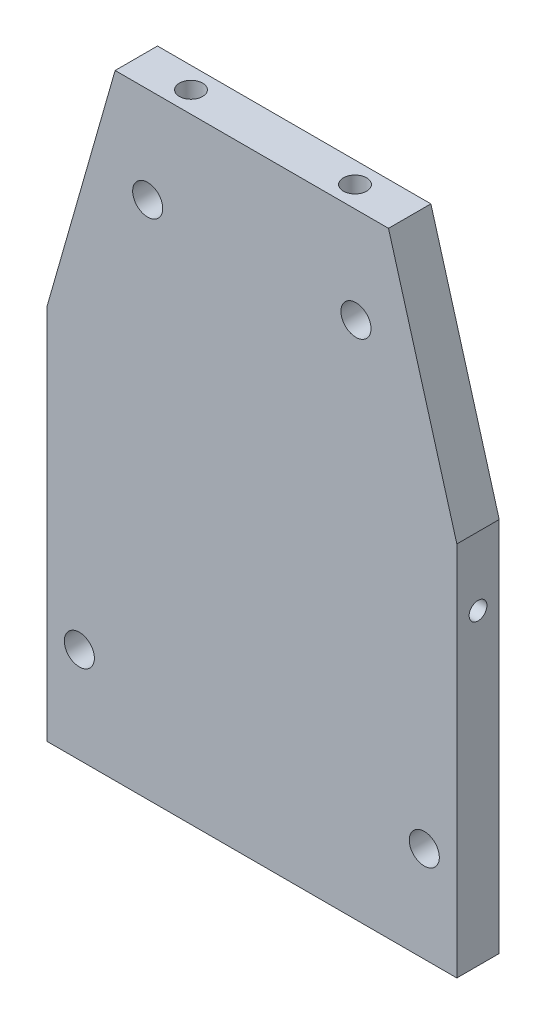
ISO-10303-21;
HEADER;
FILE_DESCRIPTION(('STEP AP214'),'2;1');
FILE_NAME('part.step','',(''),(''),'','','');
FILE_SCHEMA(('AUTOMOTIVE_DESIGN { 1 0 10303 214 1 1 1 1 }'));
ENDSEC;
DATA;
#1=APPLICATION_CONTEXT('core data for automotive mechanical design processes');
#2=APPLICATION_PROTOCOL_DEFINITION('international standard','automotive_design',2000,#1);
#3=PRODUCT_CONTEXT('',#1,'mechanical');
#4=PRODUCT('Part','Part','',(#3));
#5=PRODUCT_RELATED_PRODUCT_CATEGORY('part','',(#4));
#6=PRODUCT_DEFINITION_FORMATION('','',#4);
#7=PRODUCT_DEFINITION_CONTEXT('part definition',#1,'design');
#8=PRODUCT_DEFINITION('design','',#6,#7);
#9=PRODUCT_DEFINITION_SHAPE('','',#8);
#10=(LENGTH_UNIT() NAMED_UNIT(*) SI_UNIT(.MILLI.,.METRE.));
#11=(NAMED_UNIT(*) PLANE_ANGLE_UNIT() SI_UNIT($,.RADIAN.));
#12=(NAMED_UNIT(*) SI_UNIT($,.STERADIAN.) SOLID_ANGLE_UNIT());
#13=UNCERTAINTY_MEASURE_WITH_UNIT(LENGTH_MEASURE(1.E-05),#10,'distance_accuracy_value','');
#14=(GEOMETRIC_REPRESENTATION_CONTEXT(3) GLOBAL_UNCERTAINTY_ASSIGNED_CONTEXT((#13)) GLOBAL_UNIT_ASSIGNED_CONTEXT((#10,
#11,#12)) REPRESENTATION_CONTEXT('',''));
#15=CARTESIAN_POINT('',(0.,0.,0.));
#16=DIRECTION('',(0.,0.,1.));
#17=DIRECTION('',(1.,0.,0.));
#18=AXIS2_PLACEMENT_3D('',#15,#16,#17);
#19=CARTESIAN_POINT('',(-20.,45.,3.1));
#20=DIRECTION('',(0.961523947640823,-0.274721127897378,0.));
#21=DIRECTION('',(0.274721127897378,0.961523947640823,0.));
#22=AXIS2_PLACEMENT_3D('',#19,#20,#21);
#23=PLANE('',#22);
#24=DIRECTION('',(-0.274721127897378,-0.961523947640823,0.));
#25=VECTOR('',#24,1.);
#26=CARTESIAN_POINT('',(-20.,45.,-3.1));
#27=LINE('',#26,#25);
#28=CARTESIAN_POINT('',(-20.,45.,-3.1));
#29=VERTEX_POINT('',#28);
#30=CARTESIAN_POINT('',(-30.,9.99999999999999,-3.1));
#31=VERTEX_POINT('',#30);
#32=EDGE_CURVE('E128',#29,#31,#27,.T.);
#33=ORIENTED_EDGE('',*,*,#32,.T.);
#34=DIRECTION('',(0.,0.,-1.));
#35=VECTOR('',#34,1.);
#36=CARTESIAN_POINT('',(-30.,9.99999999999999,3.1));
#37=LINE('',#36,#35);
#38=CARTESIAN_POINT('',(-30.,9.99999999999999,3.1));
#39=VERTEX_POINT('',#38);
#40=EDGE_CURVE('E11',#39,#31,#37,.T.);
#41=ORIENTED_EDGE('',*,*,#40,.F.);
#42=DIRECTION('',(-0.274721127897378,-0.961523947640823,0.));
#43=VECTOR('',#42,1.);
#44=CARTESIAN_POINT('',(-20.,45.,3.1));
#45=LINE('',#44,#43);
#46=CARTESIAN_POINT('',(-20.,45.,3.1));
#47=VERTEX_POINT('',#46);
#48=EDGE_CURVE('E145',#47,#39,#45,.T.);
#49=ORIENTED_EDGE('',*,*,#48,.F.);
#50=DIRECTION('',(0.,0.,-1.));
#51=VECTOR('',#50,1.);
#52=CARTESIAN_POINT('',(-20.,45.,3.1));
#53=LINE('',#52,#51);
#54=EDGE_CURVE('E124',#47,#29,#53,.T.);
#55=ORIENTED_EDGE('',*,*,#54,.T.);
#56=EDGE_LOOP('',(#33,#41,#49,#55));
#57=FACE_BOUND('',#56,.T.);
#58=ADVANCED_FACE('F39',(#57),#23,.F.);
#59=CARTESIAN_POINT('',(-30.,9.99999999999999,3.1));
#60=DIRECTION('',(1.,0.,0.));
#61=DIRECTION('',(0.,1.,0.));
#62=AXIS2_PLACEMENT_3D('',#59,#60,#61);
#63=PLANE('',#62);
#64=CARTESIAN_POINT('',(-30.,0.,0.));
#65=DIRECTION('',(-1.,0.,0.));
#66=DIRECTION('',(0.,-1.,0.));
#67=AXIS2_PLACEMENT_3D('',#64,#65,#66);
#68=CIRCLE('',#67,1.3);
#69=CARTESIAN_POINT('',(-30.,-1.3,0.));
#70=VERTEX_POINT('',#69);
#71=EDGE_CURVE('E202',#70,#70,#68,.T.);
#72=ORIENTED_EDGE('',*,*,#71,.F.);
#73=EDGE_LOOP('',(#72));
#74=FACE_BOUND('',#73,.T.);
#75=DIRECTION('',(0.,-1.,0.));
#76=VECTOR('',#75,1.);
#77=CARTESIAN_POINT('',(-30.,9.99999999999999,-3.1));
#78=LINE('',#77,#76);
#79=CARTESIAN_POINT('',(-30.,-45.,-3.1));
#80=VERTEX_POINT('',#79);
#81=EDGE_CURVE('E132',#31,#80,#78,.T.);
#82=ORIENTED_EDGE('',*,*,#81,.T.);
#83=DIRECTION('',(0.,0.,-1.));
#84=VECTOR('',#83,1.);
#85=CARTESIAN_POINT('',(-30.,-45.,3.1));
#86=LINE('',#85,#84);
#87=CARTESIAN_POINT('',(-30.,-45.,3.1));
#88=VERTEX_POINT('',#87);
#89=EDGE_CURVE('E48',#88,#80,#86,.T.);
#90=ORIENTED_EDGE('',*,*,#89,.F.);
#91=DIRECTION('',(0.,-1.,0.));
#92=VECTOR('',#91,1.);
#93=CARTESIAN_POINT('',(-30.,9.99999999999999,3.1));
#94=LINE('',#93,#92);
#95=EDGE_CURVE('E93',#39,#88,#94,.T.);
#96=ORIENTED_EDGE('',*,*,#95,.F.);
#97=ORIENTED_EDGE('',*,*,#40,.T.);
#98=EDGE_LOOP('',(#82,#90,#96,#97));
#99=FACE_BOUND('',#98,.T.);
#100=ADVANCED_FACE('F177',(#74,#99),#63,.F.);
#101=CARTESIAN_POINT('',(-30.,-45.,3.1));
#102=DIRECTION('',(0.,1.,0.));
#103=DIRECTION('',(-1.,0.,0.));
#104=AXIS2_PLACEMENT_3D('',#101,#102,#103);
#105=PLANE('',#104);
#106=CARTESIAN_POINT('',(20.,-45.,0.));
#107=DIRECTION('',(0.,-1.,0.));
#108=DIRECTION('',(1.,0.,0.));
#109=AXIS2_PLACEMENT_3D('',#106,#107,#108);
#110=CIRCLE('',#109,1.7);
#111=CARTESIAN_POINT('',(21.7,-45.,0.));
#112=VERTEX_POINT('',#111);
#113=EDGE_CURVE('E250',#112,#112,#110,.T.);
#114=ORIENTED_EDGE('',*,*,#113,.F.);
#115=EDGE_LOOP('',(#114));
#116=FACE_BOUND('',#115,.T.);
#117=CARTESIAN_POINT('',(-20.,-45.,0.));
#118=DIRECTION('',(0.,-1.,0.));
#119=DIRECTION('',(-1.,0.,0.));
#120=AXIS2_PLACEMENT_3D('',#117,#118,#119);
#121=CIRCLE('',#120,1.7);
#122=CARTESIAN_POINT('',(-21.7,-45.,0.));
#123=VERTEX_POINT('',#122);
#124=EDGE_CURVE('E258',#123,#123,#121,.T.);
#125=ORIENTED_EDGE('',*,*,#124,.F.);
#126=EDGE_LOOP('',(#125));
#127=FACE_BOUND('',#126,.T.);
#128=CARTESIAN_POINT('',(0.,-45.,0.));
#129=DIRECTION('',(0.,-1.,0.));
#130=DIRECTION('',(1.,0.,0.));
#131=AXIS2_PLACEMENT_3D('',#128,#129,#130);
#132=CIRCLE('',#131,1.7);
#133=CARTESIAN_POINT('',(1.7,-45.,0.));
#134=VERTEX_POINT('',#133);
#135=EDGE_CURVE('E222',#134,#134,#132,.T.);
#136=ORIENTED_EDGE('',*,*,#135,.F.);
#137=EDGE_LOOP('',(#136));
#138=FACE_BOUND('',#137,.T.);
#139=DIRECTION('',(1.,0.,0.));
#140=VECTOR('',#139,1.);
#141=CARTESIAN_POINT('',(-30.,-45.,-3.1));
#142=LINE('',#141,#140);
#143=CARTESIAN_POINT('',(30.,-45.,-3.1));
#144=VERTEX_POINT('',#143);
#145=EDGE_CURVE('E136',#80,#144,#142,.T.);
#146=ORIENTED_EDGE('',*,*,#145,.T.);
#147=DIRECTION('',(0.,0.,-1.));
#148=VECTOR('',#147,1.);
#149=CARTESIAN_POINT('',(30.,-45.,3.1));
#150=LINE('',#149,#148);
#151=CARTESIAN_POINT('',(30.,-45.,3.1));
#152=VERTEX_POINT('',#151);
#153=EDGE_CURVE('E117',#152,#144,#150,.T.);
#154=ORIENTED_EDGE('',*,*,#153,.F.);
#155=DIRECTION('',(1.,0.,0.));
#156=VECTOR('',#155,1.);
#157=CARTESIAN_POINT('',(-30.,-45.,3.1));
#158=LINE('',#157,#156);
#159=EDGE_CURVE('E106',#88,#152,#158,.T.);
#160=ORIENTED_EDGE('',*,*,#159,.F.);
#161=ORIENTED_EDGE('',*,*,#89,.T.);
#162=EDGE_LOOP('',(#146,#154,#160,#161));
#163=FACE_BOUND('',#162,.T.);
#164=ADVANCED_FACE('F155',(#116,#127,#138,#163),#105,.F.);
#165=CARTESIAN_POINT('',(30.,10.,3.1));
#166=DIRECTION('',(-1.,0.,0.));
#167=DIRECTION('',(0.,-1.,0.));
#168=AXIS2_PLACEMENT_3D('',#165,#166,#167);
#169=PLANE('',#168);
#170=CARTESIAN_POINT('',(30.,0.,0.));
#171=DIRECTION('',(-1.,0.,0.));
#172=DIRECTION('',(0.,-1.,0.));
#173=AXIS2_PLACEMENT_3D('',#170,#171,#172);
#174=CIRCLE('',#173,1.3);
#175=CARTESIAN_POINT('',(30.,-1.3,0.));
#176=VERTEX_POINT('',#175);
#177=EDGE_CURVE('E195',#176,#176,#174,.T.);
#178=ORIENTED_EDGE('',*,*,#177,.T.);
#179=EDGE_LOOP('',(#178));
#180=FACE_BOUND('',#179,.T.);
#181=DIRECTION('',(0.,1.,0.));
#182=VECTOR('',#181,1.);
#183=CARTESIAN_POINT('',(30.,10.,-3.1));
#184=LINE('',#183,#182);
#185=CARTESIAN_POINT('',(30.,10.,-3.1));
#186=VERTEX_POINT('',#185);
#187=EDGE_CURVE('E115',#144,#186,#184,.T.);
#188=ORIENTED_EDGE('',*,*,#187,.T.);
#189=DIRECTION('',(0.,0.,-1.));
#190=VECTOR('',#189,1.);
#191=CARTESIAN_POINT('',(30.,10.,3.1));
#192=LINE('',#191,#190);
#193=CARTESIAN_POINT('',(30.,10.,3.1));
#194=VERTEX_POINT('',#193);
#195=EDGE_CURVE('E112',#194,#186,#192,.T.);
#196=ORIENTED_EDGE('',*,*,#195,.F.);
#197=DIRECTION('',(0.,1.,0.));
#198=VECTOR('',#197,1.);
#199=CARTESIAN_POINT('',(30.,10.,3.1));
#200=LINE('',#199,#198);
#201=EDGE_CURVE('E100',#152,#194,#200,.T.);
#202=ORIENTED_EDGE('',*,*,#201,.F.);
#203=ORIENTED_EDGE('',*,*,#153,.T.);
#204=EDGE_LOOP('',(#188,#196,#202,#203));
#205=FACE_BOUND('',#204,.T.);
#206=ADVANCED_FACE('F113',(#180,#205),#169,.F.);
#207=CARTESIAN_POINT('',(20.,45.,3.1));
#208=DIRECTION('',(-0.961523947640823,-0.274721127897379,0.));
#209=DIRECTION('',(0.274721127897379,-0.961523947640823,0.));
#210=AXIS2_PLACEMENT_3D('',#207,#208,#209);
#211=PLANE('',#210);
#212=DIRECTION('',(-0.274721127897379,0.961523947640823,0.));
#213=VECTOR('',#212,1.);
#214=CARTESIAN_POINT('',(20.,45.,-3.1));
#215=LINE('',#214,#213);
#216=CARTESIAN_POINT('',(20.,45.,-3.1));
#217=VERTEX_POINT('',#216);
#218=EDGE_CURVE('E79',#186,#217,#215,.T.);
#219=ORIENTED_EDGE('',*,*,#218,.T.);
#220=DIRECTION('',(0.,0.,-1.));
#221=VECTOR('',#220,1.);
#222=CARTESIAN_POINT('',(20.,45.,3.1));
#223=LINE('',#222,#221);
#224=CARTESIAN_POINT('',(20.,45.,3.1));
#225=VERTEX_POINT('',#224);
#226=EDGE_CURVE('E118',#225,#217,#223,.T.);
#227=ORIENTED_EDGE('',*,*,#226,.F.);
#228=DIRECTION('',(-0.274721127897379,0.961523947640823,0.));
#229=VECTOR('',#228,1.);
#230=CARTESIAN_POINT('',(20.,45.,3.1));
#231=LINE('',#230,#229);
#232=EDGE_CURVE('E104',#194,#225,#231,.T.);
#233=ORIENTED_EDGE('',*,*,#232,.F.);
#234=ORIENTED_EDGE('',*,*,#195,.T.);
#235=EDGE_LOOP('',(#219,#227,#233,#234));
#236=FACE_BOUND('',#235,.T.);
#237=ADVANCED_FACE('F120',(#236),#211,.F.);
#238=CARTESIAN_POINT('',(-20.,45.,3.1));
#239=DIRECTION('',(0.,-1.,0.));
#240=DIRECTION('',(1.,0.,0.));
#241=AXIS2_PLACEMENT_3D('',#238,#239,#240);
#242=PLANE('',#241);
#243=CARTESIAN_POINT('',(-12.,45.,0.));
#244=DIRECTION('',(0.,1.,0.));
#245=DIRECTION('',(-1.,0.,0.));
#246=AXIS2_PLACEMENT_3D('',#243,#244,#245);
#247=CIRCLE('',#246,1.7);
#248=CARTESIAN_POINT('',(-13.7,45.,0.));
#249=VERTEX_POINT('',#248);
#250=EDGE_CURVE('E272',#249,#249,#247,.T.);
#251=ORIENTED_EDGE('',*,*,#250,.F.);
#252=EDGE_LOOP('',(#251));
#253=FACE_BOUND('',#252,.T.);
#254=CARTESIAN_POINT('',(12.,45.,0.));
#255=DIRECTION('',(0.,1.,0.));
#256=DIRECTION('',(1.,0.,0.));
#257=AXIS2_PLACEMENT_3D('',#254,#255,#256);
#258=CIRCLE('',#257,1.7);
#259=CARTESIAN_POINT('',(13.7,45.,0.));
#260=VERTEX_POINT('',#259);
#261=EDGE_CURVE('E249',#260,#260,#258,.T.);
#262=ORIENTED_EDGE('',*,*,#261,.F.);
#263=EDGE_LOOP('',(#262));
#264=FACE_BOUND('',#263,.T.);
#265=DIRECTION('',(-1.,0.,0.));
#266=VECTOR('',#265,1.);
#267=CARTESIAN_POINT('',(-20.,45.,-3.1));
#268=LINE('',#267,#266);
#269=EDGE_CURVE('E85',#217,#29,#268,.T.);
#270=ORIENTED_EDGE('',*,*,#269,.T.);
#271=ORIENTED_EDGE('',*,*,#54,.F.);
#272=DIRECTION('',(-1.,0.,0.));
#273=VECTOR('',#272,1.);
#274=CARTESIAN_POINT('',(-20.,45.,3.1));
#275=LINE('',#274,#273);
#276=EDGE_CURVE('E56',#225,#47,#275,.T.);
#277=ORIENTED_EDGE('',*,*,#276,.F.);
#278=ORIENTED_EDGE('',*,*,#226,.T.);
#279=EDGE_LOOP('',(#270,#271,#277,#278));
#280=FACE_BOUND('',#279,.T.);
#281=ADVANCED_FACE('F162',(#253,#264,#280),#242,.F.);
#282=CARTESIAN_POINT('',(0.,0.,3.1));
#283=DIRECTION('',(0.,0.,1.));
#284=DIRECTION('',(1.,0.,0.));
#285=AXIS2_PLACEMENT_3D('',#282,#283,#284);
#286=PLANE('',#285);
#287=CARTESIAN_POINT('',(-25.2375,-31.,3.1));
#288=DIRECTION('',(0.,0.,1.));
#289=DIRECTION('',(1.,0.,0.));
#290=AXIS2_PLACEMENT_3D('',#287,#288,#289);
#291=CIRCLE('',#290,2.2);
#292=CARTESIAN_POINT('',(-23.0375,-31.,3.1));
#293=VERTEX_POINT('',#292);
#294=EDGE_CURVE('E213',#293,#293,#291,.T.);
#295=ORIENTED_EDGE('',*,*,#294,.F.);
#296=EDGE_LOOP('',(#295));
#297=FACE_BOUND('',#296,.T.);
#298=CARTESIAN_POINT('',(15.2374999999996,31.,3.1));
#299=DIRECTION('',(0.,0.,1.));
#300=DIRECTION('',(-1.,0.,0.));
#301=AXIS2_PLACEMENT_3D('',#298,#299,#300);
#302=CIRCLE('',#301,2.2);
#303=CARTESIAN_POINT('',(13.0374999999996,31.,3.1));
#304=VERTEX_POINT('',#303);
#305=EDGE_CURVE('E209',#304,#304,#302,.T.);
#306=ORIENTED_EDGE('',*,*,#305,.F.);
#307=EDGE_LOOP('',(#306));
#308=FACE_BOUND('',#307,.T.);
#309=CARTESIAN_POINT('',(-15.2374999999996,31.,3.1));
#310=DIRECTION('',(0.,0.,1.));
#311=DIRECTION('',(1.,0.,0.));
#312=AXIS2_PLACEMENT_3D('',#309,#310,#311);
#313=CIRCLE('',#312,2.2);
#314=CARTESIAN_POINT('',(-13.0374999999996,31.,3.1));
#315=VERTEX_POINT('',#314);
#316=EDGE_CURVE('E230',#315,#315,#313,.T.);
#317=ORIENTED_EDGE('',*,*,#316,.F.);
#318=EDGE_LOOP('',(#317));
#319=FACE_BOUND('',#318,.T.);
#320=CARTESIAN_POINT('',(25.2375,-31.,3.1));
#321=DIRECTION('',(0.,0.,1.));
#322=DIRECTION('',(-1.,0.,0.));
#323=AXIS2_PLACEMENT_3D('',#320,#321,#322);
#324=CIRCLE('',#323,2.2);
#325=CARTESIAN_POINT('',(23.0375,-31.,3.1));
#326=VERTEX_POINT('',#325);
#327=EDGE_CURVE('E231',#326,#326,#324,.T.);
#328=ORIENTED_EDGE('',*,*,#327,.F.);
#329=EDGE_LOOP('',(#328));
#330=FACE_BOUND('',#329,.T.);
#331=ORIENTED_EDGE('',*,*,#48,.T.);
#332=ORIENTED_EDGE('',*,*,#95,.T.);
#333=ORIENTED_EDGE('',*,*,#159,.T.);
#334=ORIENTED_EDGE('',*,*,#201,.T.);
#335=ORIENTED_EDGE('',*,*,#232,.T.);
#336=ORIENTED_EDGE('',*,*,#276,.T.);
#337=EDGE_LOOP('',(#331,#332,#333,#334,#335,#336));
#338=FACE_BOUND('',#337,.T.);
#339=ADVANCED_FACE('F102',(#297,#308,#319,#330,#338),#286,.T.);
#340=CARTESIAN_POINT('',(0.,0.,-3.1));
#341=DIRECTION('',(0.,0.,1.));
#342=DIRECTION('',(1.,0.,0.));
#343=AXIS2_PLACEMENT_3D('',#340,#341,#342);
#344=PLANE('',#343);
#345=CARTESIAN_POINT('',(-25.2375,-31.,-3.1));
#346=DIRECTION('',(0.,0.,1.));
#347=DIRECTION('',(1.,0.,0.));
#348=AXIS2_PLACEMENT_3D('',#345,#346,#347);
#349=CIRCLE('',#348,2.2);
#350=CARTESIAN_POINT('',(-23.0375,-31.,-3.1));
#351=VERTEX_POINT('',#350);
#352=EDGE_CURVE('E217',#351,#351,#349,.F.);
#353=ORIENTED_EDGE('',*,*,#352,.F.);
#354=EDGE_LOOP('',(#353));
#355=FACE_BOUND('',#354,.T.);
#356=CARTESIAN_POINT('',(15.2374999999996,31.,-3.1));
#357=DIRECTION('',(0.,0.,1.));
#358=DIRECTION('',(1.,0.,0.));
#359=AXIS2_PLACEMENT_3D('',#356,#357,#358);
#360=CIRCLE('',#359,2.2);
#361=CARTESIAN_POINT('',(17.4374999999996,31.,-3.1));
#362=VERTEX_POINT('',#361);
#363=EDGE_CURVE('E226',#362,#362,#360,.F.);
#364=ORIENTED_EDGE('',*,*,#363,.F.);
#365=EDGE_LOOP('',(#364));
#366=FACE_BOUND('',#365,.T.);
#367=CARTESIAN_POINT('',(-15.2374999999996,31.,-3.1));
#368=DIRECTION('',(0.,0.,1.));
#369=DIRECTION('',(1.,0.,0.));
#370=AXIS2_PLACEMENT_3D('',#367,#368,#369);
#371=CIRCLE('',#370,2.2);
#372=CARTESIAN_POINT('',(-13.0374999999996,31.,-3.1));
#373=VERTEX_POINT('',#372);
#374=EDGE_CURVE('E235',#373,#373,#371,.F.);
#375=ORIENTED_EDGE('',*,*,#374,.F.);
#376=EDGE_LOOP('',(#375));
#377=FACE_BOUND('',#376,.T.);
#378=CARTESIAN_POINT('',(25.2375,-31.,-3.1));
#379=DIRECTION('',(0.,0.,1.));
#380=DIRECTION('',(1.,0.,0.));
#381=AXIS2_PLACEMENT_3D('',#378,#379,#380);
#382=CIRCLE('',#381,2.2);
#383=CARTESIAN_POINT('',(27.4375,-31.,-3.1));
#384=VERTEX_POINT('',#383);
#385=EDGE_CURVE('E218',#384,#384,#382,.F.);
#386=ORIENTED_EDGE('',*,*,#385,.F.);
#387=EDGE_LOOP('',(#386));
#388=FACE_BOUND('',#387,.T.);
#389=ORIENTED_EDGE('',*,*,#32,.F.);
#390=ORIENTED_EDGE('',*,*,#269,.F.);
#391=ORIENTED_EDGE('',*,*,#218,.F.);
#392=ORIENTED_EDGE('',*,*,#187,.F.);
#393=ORIENTED_EDGE('',*,*,#145,.F.);
#394=ORIENTED_EDGE('',*,*,#81,.F.);
#395=EDGE_LOOP('',(#389,#390,#391,#392,#393,#394));
#396=FACE_BOUND('',#395,.T.);
#397=ADVANCED_FACE('F158',(#355,#366,#377,#388,#396),#344,.F.);
#398=CARTESIAN_POINT('',(12.,37.,0.));
#399=DIRECTION('',(0.,1.,0.));
#400=DIRECTION('',(-1.,0.,0.));
#401=AXIS2_PLACEMENT_3D('',#398,#399,#400);
#402=CYLINDRICAL_SURFACE('',#401,1.7);
#403=CARTESIAN_POINT('',(12.,37.,0.));
#404=DIRECTION('',(0.,1.,0.));
#405=DIRECTION('',(1.,0.,0.));
#406=AXIS2_PLACEMENT_3D('',#403,#404,#405);
#407=CIRCLE('',#406,1.7);
#408=CARTESIAN_POINT('',(13.7,37.,0.));
#409=VERTEX_POINT('',#408);
#410=EDGE_CURVE('E276',#409,#409,#407,.T.);
#411=ORIENTED_EDGE('',*,*,#410,.F.);
#412=EDGE_LOOP('',(#411));
#413=FACE_BOUND('',#412,.T.);
#414=ORIENTED_EDGE('',*,*,#261,.T.);
#415=EDGE_LOOP('',(#414));
#416=FACE_BOUND('',#415,.T.);
#417=ADVANCED_FACE('F289',(#413,#416),#402,.F.);
#418=CARTESIAN_POINT('',(12.,37.,0.));
#419=DIRECTION('',(0.,-1.,0.));
#420=DIRECTION('',(1.,0.,0.));
#421=AXIS2_PLACEMENT_3D('',#418,#419,#420);
#422=PLANE('',#421);
#423=ORIENTED_EDGE('',*,*,#410,.T.);
#424=EDGE_LOOP('',(#423));
#425=FACE_BOUND('',#424,.T.);
#426=ADVANCED_FACE('F291',(#425),#422,.F.);
#427=CARTESIAN_POINT('',(-12.,37.,0.));
#428=DIRECTION('',(0.,1.,0.));
#429=DIRECTION('',(-1.,0.,0.));
#430=AXIS2_PLACEMENT_3D('',#427,#428,#429);
#431=CYLINDRICAL_SURFACE('',#430,1.7);
#432=CARTESIAN_POINT('',(-12.,37.,0.));
#433=DIRECTION('',(0.,1.,0.));
#434=DIRECTION('',(-1.,0.,0.));
#435=AXIS2_PLACEMENT_3D('',#432,#433,#434);
#436=CIRCLE('',#435,1.7);
#437=CARTESIAN_POINT('',(-13.7,37.,0.));
#438=VERTEX_POINT('',#437);
#439=EDGE_CURVE('E133',#438,#438,#436,.T.);
#440=ORIENTED_EDGE('',*,*,#439,.F.);
#441=EDGE_LOOP('',(#440));
#442=FACE_BOUND('',#441,.T.);
#443=ORIENTED_EDGE('',*,*,#250,.T.);
#444=EDGE_LOOP('',(#443));
#445=FACE_BOUND('',#444,.T.);
#446=ADVANCED_FACE('F298',(#442,#445),#431,.F.);
#447=CARTESIAN_POINT('',(-12.,37.,0.));
#448=DIRECTION('',(0.,1.,0.));
#449=DIRECTION('',(-1.,0.,0.));
#450=AXIS2_PLACEMENT_3D('',#447,#448,#449);
#451=PLANE('',#450);
#452=ORIENTED_EDGE('',*,*,#439,.T.);
#453=EDGE_LOOP('',(#452));
#454=FACE_BOUND('',#453,.T.);
#455=ADVANCED_FACE('F306',(#454),#451,.T.);
#456=CARTESIAN_POINT('',(0.,-37.,0.));
#457=DIRECTION('',(0.,-1.,0.));
#458=DIRECTION('',(1.,0.,0.));
#459=AXIS2_PLACEMENT_3D('',#456,#457,#458);
#460=CYLINDRICAL_SURFACE('',#459,1.7);
#461=CARTESIAN_POINT('',(0.,-37.,0.));
#462=DIRECTION('',(0.,-1.,0.));
#463=DIRECTION('',(1.,0.,0.));
#464=AXIS2_PLACEMENT_3D('',#461,#462,#463);
#465=CIRCLE('',#464,1.7);
#466=CARTESIAN_POINT('',(1.7,-37.,0.));
#467=VERTEX_POINT('',#466);
#468=EDGE_CURVE('E262',#467,#467,#465,.T.);
#469=ORIENTED_EDGE('',*,*,#468,.F.);
#470=EDGE_LOOP('',(#469));
#471=FACE_BOUND('',#470,.T.);
#472=ORIENTED_EDGE('',*,*,#135,.T.);
#473=EDGE_LOOP('',(#472));
#474=FACE_BOUND('',#473,.T.);
#475=ADVANCED_FACE('F310',(#471,#474),#460,.F.);
#476=CARTESIAN_POINT('',(0.,-37.,0.));
#477=DIRECTION('',(0.,-1.,0.));
#478=DIRECTION('',(1.,0.,0.));
#479=AXIS2_PLACEMENT_3D('',#476,#477,#478);
#480=PLANE('',#479);
#481=ORIENTED_EDGE('',*,*,#468,.T.);
#482=EDGE_LOOP('',(#481));
#483=FACE_BOUND('',#482,.T.);
#484=ADVANCED_FACE('F314',(#483),#480,.T.);
#485=CARTESIAN_POINT('',(-20.,-37.,0.));
#486=DIRECTION('',(0.,-1.,0.));
#487=DIRECTION('',(1.,0.,0.));
#488=AXIS2_PLACEMENT_3D('',#485,#486,#487);
#489=CYLINDRICAL_SURFACE('',#488,1.7);
#490=CARTESIAN_POINT('',(-20.,-37.,0.));
#491=DIRECTION('',(0.,-1.,0.));
#492=DIRECTION('',(-1.,0.,0.));
#493=AXIS2_PLACEMENT_3D('',#490,#491,#492);
#494=CIRCLE('',#493,1.7);
#495=CARTESIAN_POINT('',(-21.7,-37.,0.));
#496=VERTEX_POINT('',#495);
#497=EDGE_CURVE('E254',#496,#496,#494,.T.);
#498=ORIENTED_EDGE('',*,*,#497,.F.);
#499=EDGE_LOOP('',(#498));
#500=FACE_BOUND('',#499,.T.);
#501=ORIENTED_EDGE('',*,*,#124,.T.);
#502=EDGE_LOOP('',(#501));
#503=FACE_BOUND('',#502,.T.);
#504=ADVANCED_FACE('F318',(#500,#503),#489,.F.);
#505=CARTESIAN_POINT('',(-20.,-37.,0.));
#506=DIRECTION('',(0.,1.,0.));
#507=DIRECTION('',(-1.,0.,0.));
#508=AXIS2_PLACEMENT_3D('',#505,#506,#507);
#509=PLANE('',#508);
#510=ORIENTED_EDGE('',*,*,#497,.T.);
#511=EDGE_LOOP('',(#510));
#512=FACE_BOUND('',#511,.T.);
#513=ADVANCED_FACE('F322',(#512),#509,.F.);
#514=CARTESIAN_POINT('',(20.,-37.,0.));
#515=DIRECTION('',(0.,-1.,0.));
#516=DIRECTION('',(1.,0.,0.));
#517=AXIS2_PLACEMENT_3D('',#514,#515,#516);
#518=CYLINDRICAL_SURFACE('',#517,1.7);
#519=CARTESIAN_POINT('',(20.,-37.,0.));
#520=DIRECTION('',(0.,-1.,0.));
#521=DIRECTION('',(1.,0.,0.));
#522=AXIS2_PLACEMENT_3D('',#519,#520,#521);
#523=CIRCLE('',#522,1.7);
#524=CARTESIAN_POINT('',(21.7,-37.,0.));
#525=VERTEX_POINT('',#524);
#526=EDGE_CURVE('E245',#525,#525,#523,.T.);
#527=ORIENTED_EDGE('',*,*,#526,.F.);
#528=EDGE_LOOP('',(#527));
#529=FACE_BOUND('',#528,.T.);
#530=ORIENTED_EDGE('',*,*,#113,.T.);
#531=EDGE_LOOP('',(#530));
#532=FACE_BOUND('',#531,.T.);
#533=ADVANCED_FACE('F326',(#529,#532),#518,.F.);
#534=CARTESIAN_POINT('',(20.,-37.,0.));
#535=DIRECTION('',(0.,-1.,0.));
#536=DIRECTION('',(1.,0.,0.));
#537=AXIS2_PLACEMENT_3D('',#534,#535,#536);
#538=PLANE('',#537);
#539=ORIENTED_EDGE('',*,*,#526,.T.);
#540=EDGE_LOOP('',(#539));
#541=FACE_BOUND('',#540,.T.);
#542=ADVANCED_FACE('F330',(#541),#538,.T.);
#543=CARTESIAN_POINT('',(25.2375,-31.,-9.32253967444162));
#544=DIRECTION('',(0.,0.,1.));
#545=DIRECTION('',(1.,0.,0.));
#546=AXIS2_PLACEMENT_3D('',#543,#544,#545);
#547=CYLINDRICAL_SURFACE('',#546,2.2);
#548=ORIENTED_EDGE('',*,*,#385,.T.);
#549=EDGE_LOOP('',(#548));
#550=FACE_BOUND('',#549,.T.);
#551=ORIENTED_EDGE('',*,*,#327,.T.);
#552=EDGE_LOOP('',(#551));
#553=FACE_BOUND('',#552,.T.);
#554=ADVANCED_FACE('F334',(#550,#553),#547,.F.);
#555=CARTESIAN_POINT('',(-15.2374999999996,31.,-9.32253967444162));
#556=DIRECTION('',(0.,0.,1.));
#557=DIRECTION('',(1.,0.,0.));
#558=AXIS2_PLACEMENT_3D('',#555,#556,#557);
#559=CYLINDRICAL_SURFACE('',#558,2.2);
#560=ORIENTED_EDGE('',*,*,#374,.T.);
#561=EDGE_LOOP('',(#560));
#562=FACE_BOUND('',#561,.T.);
#563=ORIENTED_EDGE('',*,*,#316,.T.);
#564=EDGE_LOOP('',(#563));
#565=FACE_BOUND('',#564,.T.);
#566=ADVANCED_FACE('F336',(#562,#565),#559,.F.);
#567=CARTESIAN_POINT('',(15.2374999999996,31.,-9.32253967444162));
#568=DIRECTION('',(0.,0.,1.));
#569=DIRECTION('',(1.,0.,0.));
#570=AXIS2_PLACEMENT_3D('',#567,#568,#569);
#571=CYLINDRICAL_SURFACE('',#570,2.2);
#572=ORIENTED_EDGE('',*,*,#363,.T.);
#573=EDGE_LOOP('',(#572));
#574=FACE_BOUND('',#573,.T.);
#575=ORIENTED_EDGE('',*,*,#305,.T.);
#576=EDGE_LOOP('',(#575));
#577=FACE_BOUND('',#576,.T.);
#578=ADVANCED_FACE('F339',(#574,#577),#571,.F.);
#579=CARTESIAN_POINT('',(-25.2375,-31.,-9.32253967444162));
#580=DIRECTION('',(0.,0.,1.));
#581=DIRECTION('',(1.,0.,0.));
#582=AXIS2_PLACEMENT_3D('',#579,#580,#581);
#583=CYLINDRICAL_SURFACE('',#582,2.2);
#584=ORIENTED_EDGE('',*,*,#352,.T.);
#585=EDGE_LOOP('',(#584));
#586=FACE_BOUND('',#585,.T.);
#587=ORIENTED_EDGE('',*,*,#294,.T.);
#588=EDGE_LOOP('',(#587));
#589=FACE_BOUND('',#588,.T.);
#590=ADVANCED_FACE('F346',(#586,#589),#583,.F.);
#591=CARTESIAN_POINT('',(-20.,0.,0.));
#592=DIRECTION('',(-1.,0.,0.));
#593=DIRECTION('',(0.,-1.,0.));
#594=AXIS2_PLACEMENT_3D('',#591,#592,#593);
#595=CYLINDRICAL_SURFACE('',#594,1.3);
#596=CARTESIAN_POINT('',(-20.,0.,0.));
#597=DIRECTION('',(-1.,0.,0.));
#598=DIRECTION('',(0.,-1.,0.));
#599=AXIS2_PLACEMENT_3D('',#596,#597,#598);
#600=CIRCLE('',#599,1.3);
#601=CARTESIAN_POINT('',(-20.,-1.3,0.));
#602=VERTEX_POINT('',#601);
#603=EDGE_CURVE('E205',#602,#602,#600,.T.);
#604=ORIENTED_EDGE('',*,*,#603,.F.);
#605=EDGE_LOOP('',(#604));
#606=FACE_BOUND('',#605,.T.);
#607=ORIENTED_EDGE('',*,*,#71,.T.);
#608=EDGE_LOOP('',(#607));
#609=FACE_BOUND('',#608,.T.);
#610=ADVANCED_FACE('F350',(#606,#609),#595,.F.);
#611=CARTESIAN_POINT('',(-20.,0.,0.));
#612=DIRECTION('',(-1.,0.,0.));
#613=DIRECTION('',(0.,-1.,0.));
#614=AXIS2_PLACEMENT_3D('',#611,#612,#613);
#615=PLANE('',#614);
#616=ORIENTED_EDGE('',*,*,#603,.T.);
#617=EDGE_LOOP('',(#616));
#618=FACE_BOUND('',#617,.T.);
#619=ADVANCED_FACE('F354',(#618),#615,.T.);
#620=CARTESIAN_POINT('',(20.,0.,0.));
#621=DIRECTION('',(1.,0.,0.));
#622=DIRECTION('',(0.,1.,0.));
#623=AXIS2_PLACEMENT_3D('',#620,#621,#622);
#624=CYLINDRICAL_SURFACE('',#623,1.3);
#625=CARTESIAN_POINT('',(20.,0.,0.));
#626=DIRECTION('',(-1.,0.,0.));
#627=DIRECTION('',(0.,-1.,0.));
#628=AXIS2_PLACEMENT_3D('',#625,#626,#627);
#629=CIRCLE('',#628,1.3);
#630=CARTESIAN_POINT('',(20.,-1.3,0.));
#631=VERTEX_POINT('',#630);
#632=EDGE_CURVE('E198',#631,#631,#629,.T.);
#633=ORIENTED_EDGE('',*,*,#632,.T.);
#634=EDGE_LOOP('',(#633));
#635=FACE_BOUND('',#634,.T.);
#636=ORIENTED_EDGE('',*,*,#177,.F.);
#637=EDGE_LOOP('',(#636));
#638=FACE_BOUND('',#637,.T.);
#639=ADVANCED_FACE('F358',(#635,#638),#624,.F.);
#640=CARTESIAN_POINT('',(20.,0.,0.));
#641=DIRECTION('',(1.,0.,0.));
#642=DIRECTION('',(0.,-1.,0.));
#643=AXIS2_PLACEMENT_3D('',#640,#641,#642);
#644=PLANE('',#643);
#645=ORIENTED_EDGE('',*,*,#632,.F.);
#646=EDGE_LOOP('',(#645));
#647=FACE_BOUND('',#646,.T.);
#648=ADVANCED_FACE('F362',(#647),#644,.T.);
#649=CLOSED_SHELL('',(#58,#100,#164,#206,#237,#281,#339,#397,#417,#426,#446,#455,#475,#484,#504,
#513,#533,#542,#554,#566,#578,#590,#610,#619,#639,#648));
#650=MANIFOLD_SOLID_BREP('B2',#649);
#651=ADVANCED_BREP_SHAPE_REPRESENTATION('',(#18,#650),#14);
#652=SHAPE_DEFINITION_REPRESENTATION(#9,#651);
ENDSEC;
END-ISO-10303-21;
